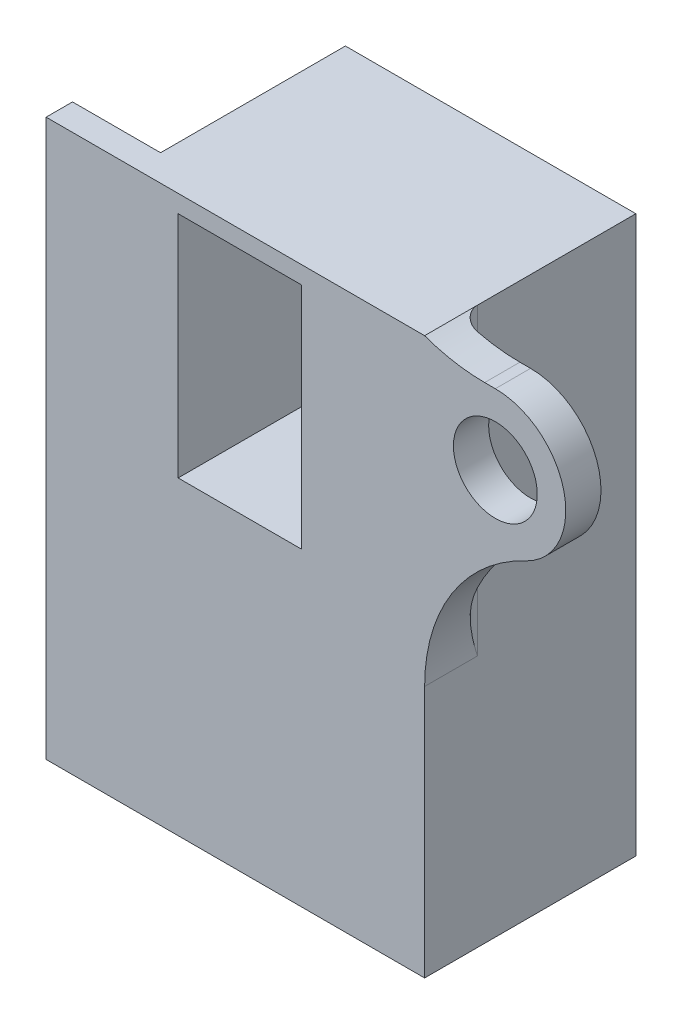
ISO-10303-21;
HEADER;
FILE_DESCRIPTION(('STEP AP214'),'2;1');
FILE_NAME('part.step','',(''),(''),'','','');
FILE_SCHEMA(('AUTOMOTIVE_DESIGN { 1 0 10303 214 1 1 1 1 }'));
ENDSEC;
DATA;
#1=APPLICATION_CONTEXT('core data for automotive mechanical design processes');
#2=APPLICATION_PROTOCOL_DEFINITION('international standard','automotive_design',2000,#1);
#3=PRODUCT_CONTEXT('',#1,'mechanical');
#4=PRODUCT('Part','Part','',(#3));
#5=PRODUCT_RELATED_PRODUCT_CATEGORY('part','',(#4));
#6=PRODUCT_DEFINITION_FORMATION('','',#4);
#7=PRODUCT_DEFINITION_CONTEXT('part definition',#1,'design');
#8=PRODUCT_DEFINITION('design','',#6,#7);
#9=PRODUCT_DEFINITION_SHAPE('','',#8);
#10=(LENGTH_UNIT() NAMED_UNIT(*) SI_UNIT(.MILLI.,.METRE.));
#11=(NAMED_UNIT(*) PLANE_ANGLE_UNIT() SI_UNIT($,.RADIAN.));
#12=(NAMED_UNIT(*) SI_UNIT($,.STERADIAN.) SOLID_ANGLE_UNIT());
#13=UNCERTAINTY_MEASURE_WITH_UNIT(LENGTH_MEASURE(1.E-05),#10,'distance_accuracy_value','');
#14=(GEOMETRIC_REPRESENTATION_CONTEXT(3) GLOBAL_UNCERTAINTY_ASSIGNED_CONTEXT((#13)) GLOBAL_UNIT_ASSIGNED_CONTEXT((#10,
#11,#12)) REPRESENTATION_CONTEXT('',''));
#15=CARTESIAN_POINT('',(0.,0.,0.));
#16=DIRECTION('',(0.,0.,1.));
#17=DIRECTION('',(1.,0.,0.));
#18=AXIS2_PLACEMENT_3D('',#15,#16,#17);
#19=CARTESIAN_POINT('',(0.,0.,0.));
#20=DIRECTION('',(1.,0.,0.));
#21=DIRECTION('',(0.,0.,-1.));
#22=AXIS2_PLACEMENT_3D('',#19,#20,#21);
#23=PLANE('',#22);
#24=DIRECTION('',(0.,0.,1.));
#25=VECTOR('',#24,1.);
#26=CARTESIAN_POINT('',(0.,33.6,-12.));
#27=LINE('',#26,#25);
#28=CARTESIAN_POINT('',(0.,33.6,-12.));
#29=VERTEX_POINT('',#28);
#30=CARTESIAN_POINT('',(0.,33.6,-1.5));
#31=VERTEX_POINT('',#30);
#32=EDGE_CURVE('E159',#29,#31,#27,.T.);
#33=ORIENTED_EDGE('',*,*,#32,.F.);
#34=DIRECTION('',(0.,1.,0.));
#35=VECTOR('',#34,1.);
#36=CARTESIAN_POINT('',(0.,2.,-12.));
#37=LINE('',#36,#35);
#38=CARTESIAN_POINT('',(0.,2.,-12.));
#39=VERTEX_POINT('',#38);
#40=EDGE_CURVE('E162',#39,#29,#37,.T.);
#41=ORIENTED_EDGE('',*,*,#40,.F.);
#42=DIRECTION('',(0.,0.,1.));
#43=VECTOR('',#42,1.);
#44=CARTESIAN_POINT('',(0.,2.,-12.));
#45=LINE('',#44,#43);
#46=CARTESIAN_POINT('',(0.,2.,-1.5));
#47=VERTEX_POINT('',#46);
#48=EDGE_CURVE('E297',#39,#47,#45,.T.);
#49=ORIENTED_EDGE('',*,*,#48,.T.);
#50=DIRECTION('',(0.,-1.,0.));
#51=VECTOR('',#50,1.);
#52=CARTESIAN_POINT('',(0.,37.1,-1.5));
#53=LINE('',#52,#51);
#54=EDGE_CURVE('E164',#31,#47,#53,.T.);
#55=ORIENTED_EDGE('',*,*,#54,.F.);
#56=EDGE_LOOP('',(#33,#41,#49,#55));
#57=FACE_BOUND('',#56,.T.);
#58=ADVANCED_FACE('F43',(#57),#23,.F.);
#59=CARTESIAN_POINT('',(16.5,0.,0.));
#60=DIRECTION('',(0.,0.,-1.));
#61=DIRECTION('',(-1.,0.,0.));
#62=AXIS2_PLACEMENT_3D('',#59,#60,#61);
#63=PLANE('',#62);
#64=DIRECTION('',(-1.,0.,0.));
#65=VECTOR('',#64,1.);
#66=CARTESIAN_POINT('',(0.,32.6,0.));
#67=LINE('',#66,#65);
#68=CARTESIAN_POINT('',(9.5,32.6,0.));
#69=VERTEX_POINT('',#68);
#70=CARTESIAN_POINT('',(2.5,32.6,0.));
#71=VERTEX_POINT('',#70);
#72=EDGE_CURVE('E238',#69,#71,#67,.T.);
#73=ORIENTED_EDGE('',*,*,#72,.F.);
#74=DIRECTION('',(0.,1.,0.));
#75=VECTOR('',#74,1.);
#76=CARTESIAN_POINT('',(9.5,0.,0.));
#77=LINE('',#76,#75);
#78=CARTESIAN_POINT('',(9.5,19.6,0.));
#79=VERTEX_POINT('',#78);
#80=EDGE_CURVE('E217',#79,#69,#77,.T.);
#81=ORIENTED_EDGE('',*,*,#80,.F.);
#82=DIRECTION('',(1.,0.,0.));
#83=VECTOR('',#82,1.);
#84=CARTESIAN_POINT('',(0.,19.6,0.));
#85=LINE('',#84,#83);
#86=CARTESIAN_POINT('',(2.5,19.6,0.));
#87=VERTEX_POINT('',#86);
#88=EDGE_CURVE('E223',#87,#79,#85,.T.);
#89=ORIENTED_EDGE('',*,*,#88,.F.);
#90=DIRECTION('',(0.,-1.,0.));
#91=VECTOR('',#90,1.);
#92=CARTESIAN_POINT('',(2.50000000000001,0.,0.));
#93=LINE('',#92,#91);
#94=EDGE_CURVE('E242',#71,#87,#93,.T.);
#95=ORIENTED_EDGE('',*,*,#94,.F.);
#96=EDGE_LOOP('',(#73,#81,#89,#95));
#97=FACE_BOUND('',#96,.T.);
#98=CARTESIAN_POINT('',(20.5182193377738,29.,0.));
#99=DIRECTION('',(0.,0.,-1.));
#100=DIRECTION('',(-1.,0.,0.));
#101=AXIS2_PLACEMENT_3D('',#98,#99,#100);
#102=CIRCLE('',#101,2.38125);
#103=CARTESIAN_POINT('',(18.1369693377738,29.,0.));
#104=VERTEX_POINT('',#103);
#105=EDGE_CURVE('E273',#104,#104,#102,.T.);
#106=ORIENTED_EDGE('',*,*,#105,.T.);
#107=EDGE_LOOP('',(#106));
#108=FACE_BOUND('',#107,.T.);
#109=DIRECTION('',(-1.,0.,0.));
#110=VECTOR('',#109,1.);
#111=CARTESIAN_POINT('',(0.,33.,0.));
#112=LINE('',#111,#110);
#113=CARTESIAN_POINT('',(20.5182193377738,33.,0.));
#114=VERTEX_POINT('',#113);
#115=CARTESIAN_POINT('',(19.9117444218464,33.,0.));
#116=VERTEX_POINT('',#115);
#117=EDGE_CURVE('E283',#114,#116,#112,.T.);
#118=ORIENTED_EDGE('',*,*,#117,.T.);
#119=CARTESIAN_POINT('',(19.9117444218464,43.,0.));
#120=DIRECTION('',(0.,0.,-1.));
#121=DIRECTION('',(-1.,0.,0.));
#122=AXIS2_PLACEMENT_3D('',#119,#120,#121);
#123=CIRCLE('',#122,10.);
#124=CARTESIAN_POINT('',(16.5,33.6,0.));
#125=VERTEX_POINT('',#124);
#126=EDGE_CURVE('E314',#116,#125,#123,.T.);
#127=ORIENTED_EDGE('',*,*,#126,.T.);
#128=DIRECTION('',(1.,0.,0.));
#129=VECTOR('',#128,1.);
#130=CARTESIAN_POINT('',(-5.,33.6,0.));
#131=LINE('',#130,#129);
#132=CARTESIAN_POINT('',(-5.,33.6,0.));
#133=VERTEX_POINT('',#132);
#134=EDGE_CURVE('E195',#133,#125,#131,.T.);
#135=ORIENTED_EDGE('',*,*,#134,.F.);
#136=DIRECTION('',(0.,1.,0.));
#137=VECTOR('',#136,1.);
#138=CARTESIAN_POINT('',(-5.,2.,0.));
#139=LINE('',#138,#137);
#140=CARTESIAN_POINT('',(-5.,2.,0.));
#141=VERTEX_POINT('',#140);
#142=EDGE_CURVE('E200',#141,#133,#139,.T.);
#143=ORIENTED_EDGE('',*,*,#142,.F.);
#144=DIRECTION('',(1.,0.,0.));
#145=VECTOR('',#144,1.);
#146=CARTESIAN_POINT('',(0.,2.,0.));
#147=LINE('',#146,#145);
#148=CARTESIAN_POINT('',(16.5,2.,0.));
#149=VERTEX_POINT('',#148);
#150=EDGE_CURVE('E300',#141,#149,#147,.T.);
#151=ORIENTED_EDGE('',*,*,#150,.T.);
#152=DIRECTION('',(0.,-1.,0.));
#153=VECTOR('',#152,1.);
#154=CARTESIAN_POINT('',(16.5,0.,0.));
#155=LINE('',#154,#153);
#156=CARTESIAN_POINT('',(16.5,16.342263231169,0.));
#157=VERTEX_POINT('',#156);
#158=EDGE_CURVE('E306',#157,#149,#155,.T.);
#159=ORIENTED_EDGE('',*,*,#158,.F.);
#160=CARTESIAN_POINT('',(26.5,16.342263231169,0.));
#161=DIRECTION('',(0.,0.,-1.));
#162=DIRECTION('',(-1.,0.,0.));
#163=AXIS2_PLACEMENT_3D('',#160,#161,#162);
#164=CIRCLE('',#163,10.);
#165=CARTESIAN_POINT('',(22.2272995269813,25.383503780334,0.));
#166=VERTEX_POINT('',#165);
#167=EDGE_CURVE('E325',#157,#166,#164,.T.);
#168=ORIENTED_EDGE('',*,*,#167,.T.);
#169=CARTESIAN_POINT('',(20.5182193377738,29.,0.));
#170=DIRECTION('',(0.,0.,1.));
#171=DIRECTION('',(1.,0.,0.));
#172=AXIS2_PLACEMENT_3D('',#169,#170,#171);
#173=CIRCLE('',#172,4.);
#174=EDGE_CURVE('E277',#114,#166,#173,.F.);
#175=ORIENTED_EDGE('',*,*,#174,.F.);
#176=EDGE_LOOP('',(#118,#127,#135,#143,#151,#159,#168,#175));
#177=FACE_BOUND('',#176,.T.);
#178=ADVANCED_FACE('F351',(#97,#108,#177),#63,.F.);
#179=CARTESIAN_POINT('',(16.5,0.,0.));
#180=DIRECTION('',(1.,0.,0.));
#181=DIRECTION('',(0.,0.,-1.));
#182=AXIS2_PLACEMENT_3D('',#179,#180,#181);
#183=PLANE('',#182);
#184=DIRECTION('',(0.,0.,1.));
#185=VECTOR('',#184,1.);
#186=CARTESIAN_POINT('',(16.5,2.,-12.));
#187=LINE('',#186,#185);
#188=CARTESIAN_POINT('',(16.5,2.,-12.));
#189=VERTEX_POINT('',#188);
#190=EDGE_CURVE('E296',#189,#149,#187,.T.);
#191=ORIENTED_EDGE('',*,*,#190,.F.);
#192=DIRECTION('',(0.,-1.,0.));
#193=VECTOR('',#192,1.);
#194=CARTESIAN_POINT('',(16.5,2.,-12.));
#195=LINE('',#194,#193);
#196=CARTESIAN_POINT('',(16.5,33.6,-12.));
#197=VERTEX_POINT('',#196);
#198=EDGE_CURVE('E178',#197,#189,#195,.T.);
#199=ORIENTED_EDGE('',*,*,#198,.F.);
#200=DIRECTION('',(0.,0.,-1.));
#201=VECTOR('',#200,1.);
#202=CARTESIAN_POINT('',(16.5,33.6,0.));
#203=LINE('',#202,#201);
#204=CARTESIAN_POINT('',(16.5,33.6,-3.));
#205=VERTEX_POINT('',#204);
#206=EDGE_CURVE('E173',#205,#197,#203,.T.);
#207=ORIENTED_EDGE('',*,*,#206,.F.);
#208=DIRECTION('',(0.,1.,0.));
#209=VECTOR('',#208,1.);
#210=CARTESIAN_POINT('',(16.5,0.,-3.));
#211=LINE('',#210,#209);
#212=CARTESIAN_POINT('',(16.5,16.342263231169,-3.));
#213=VERTEX_POINT('',#212);
#214=EDGE_CURVE('E336',#205,#213,#211,.F.);
#215=ORIENTED_EDGE('',*,*,#214,.T.);
#216=DIRECTION('',(0.,0.,1.));
#217=VECTOR('',#216,1.);
#218=CARTESIAN_POINT('',(16.5,16.342263231169,0.));
#219=LINE('',#218,#217);
#220=EDGE_CURVE('E71',#213,#157,#219,.T.);
#221=ORIENTED_EDGE('',*,*,#220,.T.);
#222=ORIENTED_EDGE('',*,*,#158,.T.);
#223=EDGE_LOOP('',(#191,#199,#207,#215,#221,#222));
#224=FACE_BOUND('',#223,.T.);
#225=ADVANCED_FACE('F365',(#224),#183,.T.);
#226=CARTESIAN_POINT('',(0.,2.,-12.));
#227=DIRECTION('',(0.,1.,0.));
#228=DIRECTION('',(0.,0.,1.));
#229=AXIS2_PLACEMENT_3D('',#226,#227,#228);
#230=PLANE('',#229);
#231=CARTESIAN_POINT('',(8.25,2.,-6.));
#232=DIRECTION('',(0.,-1.,0.));
#233=DIRECTION('',(0.,0.,-1.));
#234=AXIS2_PLACEMENT_3D('',#231,#232,#233);
#235=CIRCLE('',#234,2.38125);
#236=CARTESIAN_POINT('',(8.25,2.,-8.38125));
#237=VERTEX_POINT('',#236);
#238=EDGE_CURVE('E252',#237,#237,#235,.T.);
#239=ORIENTED_EDGE('',*,*,#238,.F.);
#240=EDGE_LOOP('',(#239));
#241=FACE_BOUND('',#240,.T.);
#242=ORIENTED_EDGE('',*,*,#48,.F.);
#243=DIRECTION('',(-1.,0.,0.));
#244=VECTOR('',#243,1.);
#245=CARTESIAN_POINT('',(0.,2.,-12.));
#246=LINE('',#245,#244);
#247=EDGE_CURVE('E168',#189,#39,#246,.T.);
#248=ORIENTED_EDGE('',*,*,#247,.F.);
#249=ORIENTED_EDGE('',*,*,#190,.T.);
#250=ORIENTED_EDGE('',*,*,#150,.F.);
#251=DIRECTION('',(0.,0.,1.));
#252=VECTOR('',#251,1.);
#253=CARTESIAN_POINT('',(-5.,2.,-1.5));
#254=LINE('',#253,#252);
#255=CARTESIAN_POINT('',(-5.,2.,-1.5));
#256=VERTEX_POINT('',#255);
#257=EDGE_CURVE('E207',#256,#141,#254,.T.);
#258=ORIENTED_EDGE('',*,*,#257,.F.);
#259=DIRECTION('',(1.,0.,0.));
#260=VECTOR('',#259,1.);
#261=CARTESIAN_POINT('',(-5.,2.,-1.5));
#262=LINE('',#261,#260);
#263=EDGE_CURVE('E211',#256,#47,#262,.T.);
#264=ORIENTED_EDGE('',*,*,#263,.T.);
#265=EDGE_LOOP('',(#242,#248,#249,#250,#258,#264));
#266=FACE_BOUND('',#265,.T.);
#267=ADVANCED_FACE('F369',(#241,#266),#230,.F.);
#268=CARTESIAN_POINT('',(20.5182193377738,29.,-2.));
#269=DIRECTION('',(0.,0.,1.));
#270=DIRECTION('',(1.,0.,0.));
#271=AXIS2_PLACEMENT_3D('',#268,#269,#270);
#272=CYLINDRICAL_SURFACE('',#271,4.);
#273=ORIENTED_EDGE('',*,*,#174,.T.);
#274=DIRECTION('',(0.,0.,1.));
#275=VECTOR('',#274,1.);
#276=CARTESIAN_POINT('',(22.2272995269813,25.383503780334,-2.));
#277=LINE('',#276,#275);
#278=CARTESIAN_POINT('',(22.2272995269813,25.383503780334,-2.));
#279=VERTEX_POINT('',#278);
#280=EDGE_CURVE('E322',#166,#279,#277,.F.);
#281=ORIENTED_EDGE('',*,*,#280,.T.);
#282=CARTESIAN_POINT('',(20.5182193377738,29.,-2.));
#283=DIRECTION('',(0.,0.,1.));
#284=DIRECTION('',(1.,0.,0.));
#285=AXIS2_PLACEMENT_3D('',#282,#283,#284);
#286=CIRCLE('',#285,4.);
#287=CARTESIAN_POINT('',(20.5182193377738,33.,-2.));
#288=VERTEX_POINT('',#287);
#289=EDGE_CURVE('E278',#288,#279,#286,.F.);
#290=ORIENTED_EDGE('',*,*,#289,.F.);
#291=DIRECTION('',(0.,0.,1.));
#292=VECTOR('',#291,1.);
#293=CARTESIAN_POINT('',(20.5182193377738,33.,-2.));
#294=LINE('',#293,#292);
#295=EDGE_CURVE('E287',#288,#114,#294,.T.);
#296=ORIENTED_EDGE('',*,*,#295,.T.);
#297=EDGE_LOOP('',(#273,#281,#290,#296));
#298=FACE_BOUND('',#297,.T.);
#299=ADVANCED_FACE('F373',(#298),#272,.T.);
#300=CARTESIAN_POINT('',(0.,33.,-2.));
#301=DIRECTION('',(0.,1.,0.));
#302=DIRECTION('',(0.,0.,1.));
#303=AXIS2_PLACEMENT_3D('',#300,#301,#302);
#304=PLANE('',#303);
#305=DIRECTION('',(-1.,0.,0.));
#306=VECTOR('',#305,1.);
#307=CARTESIAN_POINT('',(0.,33.,-2.));
#308=LINE('',#307,#306);
#309=CARTESIAN_POINT('',(19.9117444218464,33.,-2.));
#310=VERTEX_POINT('',#309);
#311=EDGE_CURVE('E282',#288,#310,#308,.T.);
#312=ORIENTED_EDGE('',*,*,#311,.T.);
#313=DIRECTION('',(0.,0.,1.));
#314=VECTOR('',#313,1.);
#315=CARTESIAN_POINT('',(19.9117444218464,33.,0.));
#316=LINE('',#315,#314);
#317=EDGE_CURVE('E310',#310,#116,#316,.T.);
#318=ORIENTED_EDGE('',*,*,#317,.T.);
#319=ORIENTED_EDGE('',*,*,#117,.F.);
#320=ORIENTED_EDGE('',*,*,#295,.F.);
#321=EDGE_LOOP('',(#312,#318,#319,#320));
#322=FACE_BOUND('',#321,.T.);
#323=ADVANCED_FACE('F377',(#322),#304,.T.);
#324=CARTESIAN_POINT('',(0.,0.,-2.));
#325=DIRECTION('',(0.,0.,1.));
#326=DIRECTION('',(1.,0.,0.));
#327=AXIS2_PLACEMENT_3D('',#324,#325,#326);
#328=PLANE('',#327);
#329=CARTESIAN_POINT('',(20.5182193377738,29.,-2.));
#330=DIRECTION('',(0.,0.,-1.));
#331=DIRECTION('',(-1.,0.,0.));
#332=AXIS2_PLACEMENT_3D('',#329,#330,#331);
#333=CIRCLE('',#332,2.38125);
#334=CARTESIAN_POINT('',(18.1369693377738,29.,-2.));
#335=VERTEX_POINT('',#334);
#336=EDGE_CURVE('E266',#335,#335,#333,.T.);
#337=ORIENTED_EDGE('',*,*,#336,.F.);
#338=EDGE_LOOP('',(#337));
#339=FACE_BOUND('',#338,.T.);
#340=CARTESIAN_POINT('',(26.5,16.342263231169,-2.));
#341=DIRECTION('',(0.,0.,1.));
#342=DIRECTION('',(1.,0.,0.));
#343=AXIS2_PLACEMENT_3D('',#340,#341,#342);
#344=CIRCLE('',#343,10.);
#345=CARTESIAN_POINT('',(17.5,20.7011621747097,-2.));
#346=VERTEX_POINT('',#345);
#347=EDGE_CURVE('E328',#279,#346,#344,.T.);
#348=ORIENTED_EDGE('',*,*,#347,.T.);
#349=DIRECTION('',(0.,1.,0.));
#350=VECTOR('',#349,1.);
#351=CARTESIAN_POINT('',(17.5,0.,-2.));
#352=LINE('',#351,#350);
#353=CARTESIAN_POINT('',(17.5,33.2951821839,-2.));
#354=VERTEX_POINT('',#353);
#355=EDGE_CURVE('E332',#346,#354,#352,.T.);
#356=ORIENTED_EDGE('',*,*,#355,.T.);
#357=CARTESIAN_POINT('',(19.9117444218464,43.,-2.));
#358=DIRECTION('',(0.,0.,1.));
#359=DIRECTION('',(1.,0.,0.));
#360=AXIS2_PLACEMENT_3D('',#357,#358,#359);
#361=CIRCLE('',#360,10.);
#362=EDGE_CURVE('E317',#354,#310,#361,.T.);
#363=ORIENTED_EDGE('',*,*,#362,.T.);
#364=ORIENTED_EDGE('',*,*,#311,.F.);
#365=ORIENTED_EDGE('',*,*,#289,.T.);
#366=EDGE_LOOP('',(#348,#356,#363,#364,#365));
#367=FACE_BOUND('',#366,.T.);
#368=ADVANCED_FACE('F381',(#339,#367),#328,.F.);
#369=CARTESIAN_POINT('',(20.5182193377738,29.,10.6066017177982));
#370=DIRECTION('',(0.,0.,-1.));
#371=DIRECTION('',(-1.,0.,0.));
#372=AXIS2_PLACEMENT_3D('',#369,#370,#371);
#373=CYLINDRICAL_SURFACE('',#372,2.38125);
#374=ORIENTED_EDGE('',*,*,#336,.T.);
#375=EDGE_LOOP('',(#374));
#376=FACE_BOUND('',#375,.T.);
#377=ORIENTED_EDGE('',*,*,#105,.F.);
#378=EDGE_LOOP('',(#377));
#379=FACE_BOUND('',#378,.T.);
#380=ADVANCED_FACE('F385',(#376,#379),#373,.F.);
#381=CARTESIAN_POINT('',(8.25,8.35,-6.));
#382=DIRECTION('',(0.,-1.,0.));
#383=DIRECTION('',(0.,0.,-1.));
#384=AXIS2_PLACEMENT_3D('',#381,#382,#383);
#385=CYLINDRICAL_SURFACE('',#384,2.38125);
#386=CARTESIAN_POINT('',(8.25,8.35,-6.));
#387=DIRECTION('',(0.,-1.,0.));
#388=DIRECTION('',(0.,0.,-1.));
#389=AXIS2_PLACEMENT_3D('',#386,#387,#388);
#390=CIRCLE('',#389,2.38125);
#391=CARTESIAN_POINT('',(8.25,8.35,-8.38125));
#392=VERTEX_POINT('',#391);
#393=EDGE_CURVE('E262',#392,#392,#390,.T.);
#394=ORIENTED_EDGE('',*,*,#393,.F.);
#395=EDGE_LOOP('',(#394));
#396=FACE_BOUND('',#395,.T.);
#397=ORIENTED_EDGE('',*,*,#238,.T.);
#398=EDGE_LOOP('',(#397));
#399=FACE_BOUND('',#398,.T.);
#400=ADVANCED_FACE('F389',(#396,#399),#385,.F.);
#401=CARTESIAN_POINT('',(0.,8.35,0.));
#402=DIRECTION('',(0.,-1.,0.));
#403=DIRECTION('',(0.,0.,-1.));
#404=AXIS2_PLACEMENT_3D('',#401,#402,#403);
#405=PLANE('',#404);
#406=ORIENTED_EDGE('',*,*,#393,.T.);
#407=EDGE_LOOP('',(#406));
#408=FACE_BOUND('',#407,.T.);
#409=ADVANCED_FACE('F393',(#408),#405,.T.);
#410=CARTESIAN_POINT('',(9.5,0.,-7.));
#411=DIRECTION('',(1.,0.,0.));
#412=DIRECTION('',(0.,0.,-1.));
#413=AXIS2_PLACEMENT_3D('',#410,#411,#412);
#414=PLANE('',#413);
#415=ORIENTED_EDGE('',*,*,#80,.T.);
#416=DIRECTION('',(0.,0.,1.));
#417=VECTOR('',#416,1.);
#418=CARTESIAN_POINT('',(9.5,32.6,-7.));
#419=LINE('',#418,#417);
#420=CARTESIAN_POINT('',(9.5,32.6,-7.));
#421=VERTEX_POINT('',#420);
#422=EDGE_CURVE('E235',#421,#69,#419,.T.);
#423=ORIENTED_EDGE('',*,*,#422,.F.);
#424=DIRECTION('',(0.,1.,0.));
#425=VECTOR('',#424,1.);
#426=CARTESIAN_POINT('',(9.5,0.,-7.));
#427=LINE('',#426,#425);
#428=CARTESIAN_POINT('',(9.5,19.6,-7.));
#429=VERTEX_POINT('',#428);
#430=EDGE_CURVE('E218',#429,#421,#427,.T.);
#431=ORIENTED_EDGE('',*,*,#430,.F.);
#432=DIRECTION('',(0.,0.,1.));
#433=VECTOR('',#432,1.);
#434=CARTESIAN_POINT('',(9.5,19.6,-7.));
#435=LINE('',#434,#433);
#436=EDGE_CURVE('E249',#429,#79,#435,.T.);
#437=ORIENTED_EDGE('',*,*,#436,.T.);
#438=EDGE_LOOP('',(#415,#423,#431,#437));
#439=FACE_BOUND('',#438,.T.);
#440=ADVANCED_FACE('F397',(#439),#414,.F.);
#441=CARTESIAN_POINT('',(0.,19.6,-7.));
#442=DIRECTION('',(0.,-1.,0.));
#443=DIRECTION('',(0.,0.,-1.));
#444=AXIS2_PLACEMENT_3D('',#441,#442,#443);
#445=PLANE('',#444);
#446=ORIENTED_EDGE('',*,*,#88,.T.);
#447=ORIENTED_EDGE('',*,*,#436,.F.);
#448=DIRECTION('',(1.,0.,0.));
#449=VECTOR('',#448,1.);
#450=CARTESIAN_POINT('',(0.,19.6,-7.));
#451=LINE('',#450,#449);
#452=CARTESIAN_POINT('',(2.5,19.6,-7.));
#453=VERTEX_POINT('',#452);
#454=EDGE_CURVE('E231',#453,#429,#451,.T.);
#455=ORIENTED_EDGE('',*,*,#454,.F.);
#456=DIRECTION('',(0.,0.,1.));
#457=VECTOR('',#456,1.);
#458=CARTESIAN_POINT('',(2.5,19.6,-7.));
#459=LINE('',#458,#457);
#460=EDGE_CURVE('E253',#453,#87,#459,.T.);
#461=ORIENTED_EDGE('',*,*,#460,.T.);
#462=EDGE_LOOP('',(#446,#447,#455,#461));
#463=FACE_BOUND('',#462,.T.);
#464=ADVANCED_FACE('F401',(#463),#445,.F.);
#465=CARTESIAN_POINT('',(2.50000000000001,0.,-7.));
#466=DIRECTION('',(-1.,0.,0.));
#467=DIRECTION('',(0.,-1.,0.));
#468=AXIS2_PLACEMENT_3D('',#465,#466,#467);
#469=PLANE('',#468);
#470=ORIENTED_EDGE('',*,*,#94,.T.);
#471=ORIENTED_EDGE('',*,*,#460,.F.);
#472=DIRECTION('',(0.,-1.,0.));
#473=VECTOR('',#472,1.);
#474=CARTESIAN_POINT('',(2.50000000000001,0.,-7.));
#475=LINE('',#474,#473);
#476=CARTESIAN_POINT('',(2.5,32.6,-7.));
#477=VERTEX_POINT('',#476);
#478=EDGE_CURVE('E227',#477,#453,#475,.T.);
#479=ORIENTED_EDGE('',*,*,#478,.F.);
#480=DIRECTION('',(0.,0.,1.));
#481=VECTOR('',#480,1.);
#482=CARTESIAN_POINT('',(2.5,32.6,-7.));
#483=LINE('',#482,#481);
#484=EDGE_CURVE('E256',#477,#71,#483,.T.);
#485=ORIENTED_EDGE('',*,*,#484,.T.);
#486=EDGE_LOOP('',(#470,#471,#479,#485));
#487=FACE_BOUND('',#486,.T.);
#488=ADVANCED_FACE('F407',(#487),#469,.F.);
#489=CARTESIAN_POINT('',(0.,32.6,-7.));
#490=DIRECTION('',(0.,1.,0.));
#491=DIRECTION('',(0.,0.,1.));
#492=AXIS2_PLACEMENT_3D('',#489,#490,#491);
#493=PLANE('',#492);
#494=ORIENTED_EDGE('',*,*,#72,.T.);
#495=ORIENTED_EDGE('',*,*,#484,.F.);
#496=DIRECTION('',(-1.,0.,0.));
#497=VECTOR('',#496,1.);
#498=CARTESIAN_POINT('',(0.,32.6,-7.));
#499=LINE('',#498,#497);
#500=EDGE_CURVE('E222',#421,#477,#499,.T.);
#501=ORIENTED_EDGE('',*,*,#500,.F.);
#502=ORIENTED_EDGE('',*,*,#422,.T.);
#503=EDGE_LOOP('',(#494,#495,#501,#502));
#504=FACE_BOUND('',#503,.T.);
#505=ADVANCED_FACE('F403',(#504),#493,.F.);
#506=CARTESIAN_POINT('',(0.,0.,-7.));
#507=DIRECTION('',(0.,0.,1.));
#508=DIRECTION('',(1.,0.,0.));
#509=AXIS2_PLACEMENT_3D('',#506,#507,#508);
#510=PLANE('',#509);
#511=ORIENTED_EDGE('',*,*,#430,.T.);
#512=ORIENTED_EDGE('',*,*,#500,.T.);
#513=ORIENTED_EDGE('',*,*,#478,.T.);
#514=ORIENTED_EDGE('',*,*,#454,.T.);
#515=EDGE_LOOP('',(#511,#512,#513,#514));
#516=FACE_BOUND('',#515,.T.);
#517=ADVANCED_FACE('F406',(#516),#510,.T.);
#518=CARTESIAN_POINT('',(-5.,37.1,-1.5));
#519=DIRECTION('',(0.,0.,1.));
#520=DIRECTION('',(0.,-1.,0.));
#521=AXIS2_PLACEMENT_3D('',#518,#519,#520);
#522=PLANE('',#521);
#523=DIRECTION('',(0.,-1.,0.));
#524=VECTOR('',#523,1.);
#525=CARTESIAN_POINT('',(-5.,37.1,-1.5));
#526=LINE('',#525,#524);
#527=CARTESIAN_POINT('',(-5.,33.6,-1.5));
#528=VERTEX_POINT('',#527);
#529=EDGE_CURVE('E204',#528,#256,#526,.T.);
#530=ORIENTED_EDGE('',*,*,#529,.F.);
#531=DIRECTION('',(-1.,0.,0.));
#532=VECTOR('',#531,1.);
#533=CARTESIAN_POINT('',(0.,33.6,-1.5));
#534=LINE('',#533,#532);
#535=EDGE_CURVE('E167',#31,#528,#534,.T.);
#536=ORIENTED_EDGE('',*,*,#535,.F.);
#537=ORIENTED_EDGE('',*,*,#54,.T.);
#538=ORIENTED_EDGE('',*,*,#263,.F.);
#539=EDGE_LOOP('',(#530,#536,#537,#538));
#540=FACE_BOUND('',#539,.T.);
#541=ADVANCED_FACE('F417',(#540),#522,.F.);
#542=CARTESIAN_POINT('',(-5.,0.,0.));
#543=DIRECTION('',(-1.,0.,0.));
#544=DIRECTION('',(0.,0.,1.));
#545=AXIS2_PLACEMENT_3D('',#542,#543,#544);
#546=PLANE('',#545);
#547=DIRECTION('',(0.,0.,1.));
#548=VECTOR('',#547,1.);
#549=CARTESIAN_POINT('',(-5.,33.6,-1.5));
#550=LINE('',#549,#548);
#551=EDGE_CURVE('E192',#528,#133,#550,.T.);
#552=ORIENTED_EDGE('',*,*,#551,.F.);
#553=ORIENTED_EDGE('',*,*,#529,.T.);
#554=ORIENTED_EDGE('',*,*,#257,.T.);
#555=ORIENTED_EDGE('',*,*,#142,.T.);
#556=EDGE_LOOP('',(#552,#553,#554,#555));
#557=FACE_BOUND('',#556,.T.);
#558=ADVANCED_FACE('F421',(#557),#546,.T.);
#559=CARTESIAN_POINT('',(0.,33.6,0.));
#560=DIRECTION('',(0.,-1.,0.));
#561=DIRECTION('',(0.,0.,-1.));
#562=AXIS2_PLACEMENT_3D('',#559,#560,#561);
#563=PLANE('',#562);
#564=ORIENTED_EDGE('',*,*,#206,.T.);
#565=DIRECTION('',(1.,0.,0.));
#566=VECTOR('',#565,1.);
#567=CARTESIAN_POINT('',(0.,33.6,-12.));
#568=LINE('',#567,#566);
#569=EDGE_CURVE('E171',#29,#197,#568,.T.);
#570=ORIENTED_EDGE('',*,*,#569,.F.);
#571=ORIENTED_EDGE('',*,*,#32,.T.);
#572=ORIENTED_EDGE('',*,*,#535,.T.);
#573=ORIENTED_EDGE('',*,*,#551,.T.);
#574=ORIENTED_EDGE('',*,*,#134,.T.);
#575=EDGE_CURVE('E64',#125,#205,#203,.T.);
#576=ORIENTED_EDGE('',*,*,#575,.T.);
#577=EDGE_LOOP('',(#564,#570,#571,#572,#573,#574,#576));
#578=FACE_BOUND('',#577,.T.);
#579=ADVANCED_FACE('F172',(#578),#563,.F.);
#580=CARTESIAN_POINT('',(19.9117444218464,43.,0.));
#581=DIRECTION('',(0.,0.,-1.));
#582=DIRECTION('',(-1.,0.,0.));
#583=AXIS2_PLACEMENT_3D('',#580,#581,#582);
#584=CYLINDRICAL_SURFACE('',#583,10.);
#585=ORIENTED_EDGE('',*,*,#362,.F.);
#586=CARTESIAN_POINT('',(17.5,33.2951821839,-2.));
#587=CARTESIAN_POINT('',(17.4416882046076,33.3096521513916,-1.99996377159555));
#588=CARTESIAN_POINT('',(17.3835448570359,33.3246797672575,-2.00509729641203));
#589=CARTESIAN_POINT('',(17.2691894306341,33.3552970068834,-2.02528178802682));
#590=CARTESIAN_POINT('',(17.2129763122904,33.370886318572,-2.04032732575709));
#591=CARTESIAN_POINT('',(17.1039998442129,33.4020931624776,-2.07991778830303));
#592=CARTESIAN_POINT('',(17.0512370422384,33.417710698773,-2.10446421718611));
#593=CARTESIAN_POINT('',(16.9506212007074,33.4483242872222,-2.16241344629458));
#594=CARTESIAN_POINT('',(16.9027678199665,33.4633203825204,-2.19581563050275));
#595=CARTESIAN_POINT('',(16.8133948734528,33.4919804261872,-2.27063887890849));
#596=CARTESIAN_POINT('',(16.7718704395181,33.5056453954947,-2.31205372362896));
#597=CARTESIAN_POINT('',(16.6964431848553,33.5309227438538,-2.40189151600445));
#598=CARTESIAN_POINT('',(16.6625404522537,33.5425350991717,-2.45031454468144));
#599=CARTESIAN_POINT('',(16.6046947097274,33.5626100803941,-2.55092090933748));
#600=CARTESIAN_POINT('',(16.5804299370159,33.5711732462641,-2.60289915195508));
#601=CARTESIAN_POINT('',(16.5410873005675,33.5851653108669,-2.71058607085887));
#602=CARTESIAN_POINT('',(16.5259962909772,33.590598693939,-2.76628928157378));
#603=CARTESIAN_POINT('',(16.5105487685177,33.5961765065227,-2.85211540040821));
#604=CARTESIAN_POINT('',(16.5065958447039,33.5976080034534,-2.88155237267648));
#605=CARTESIAN_POINT('',(16.5013224671775,33.5995199180946,-2.94065406686891));
#606=CARTESIAN_POINT('',(16.4999986917682,33.600001535888,-2.97031845382046));
#607=CARTESIAN_POINT('',(16.5,33.6,-3.));
#608=B_SPLINE_CURVE_WITH_KNOTS('',3,(#586,#587,#588,#589,#590,#591,#592,#593,#594,#595,#596,
#597,#598,#599,#600,#601,#602,#603,#604,#605,#606,#607),.UNSPECIFIED.,.F.,.F.,(4,2,2,2,2,2,2,2,
2,2,4),(0.,0.179979391065258,0.359860284590325,0.539769666360691,0.719666536695732,
0.899424326151548,1.07918419396243,1.25230100574518,1.42516915555092,1.51425951775296,
1.60323725036706),.UNSPECIFIED.);
#609=EDGE_CURVE('E57',#354,#205,#608,.T.);
#610=ORIENTED_EDGE('',*,*,#609,.T.);
#611=ORIENTED_EDGE('',*,*,#575,.F.);
#612=ORIENTED_EDGE('',*,*,#126,.F.);
#613=ORIENTED_EDGE('',*,*,#317,.F.);
#614=EDGE_LOOP('',(#585,#610,#611,#612,#613));
#615=FACE_BOUND('',#614,.T.);
#616=ADVANCED_FACE('F345',(#615),#584,.F.);
#617=CARTESIAN_POINT('',(26.5,16.342263231169,-2.));
#618=DIRECTION('',(0.,0.,1.));
#619=DIRECTION('',(1.,0.,0.));
#620=AXIS2_PLACEMENT_3D('',#617,#618,#619);
#621=CYLINDRICAL_SURFACE('',#620,10.);
#622=ORIENTED_EDGE('',*,*,#347,.F.);
#623=ORIENTED_EDGE('',*,*,#280,.F.);
#624=ORIENTED_EDGE('',*,*,#167,.F.);
#625=ORIENTED_EDGE('',*,*,#220,.F.);
#626=CARTESIAN_POINT('',(17.5,20.7011621747097,-2.));
#627=CARTESIAN_POINT('',(17.4649705918882,20.6288396959497,-2.00001517907888));
#628=CARTESIAN_POINT('',(17.4308249738421,20.556111587016,-2.00183974990828));
#629=CARTESIAN_POINT('',(17.3643618176126,20.4100074789031,-2.00867500405915));
#630=CARTESIAN_POINT('',(17.3320435036572,20.336631770189,-2.01368432408378));
#631=CARTESIAN_POINT('',(17.2693266347427,20.1894773913306,-2.02644469931918));
#632=CARTESIAN_POINT('',(17.2389244580283,20.1156997864008,-2.03419038738089));
#633=CARTESIAN_POINT('',(17.1799867691033,19.9676874000717,-2.05208658188006));
#634=CARTESIAN_POINT('',(17.1514514850332,19.8934525640055,-2.06223738153228));
#635=CARTESIAN_POINT('',(17.0688926274996,19.6708057930277,-2.09574919733705));
#636=CARTESIAN_POINT('',(17.017647311377,19.5218199539269,-2.12222969644671));
#637=CARTESIAN_POINT('',(16.9225479634451,19.2227266295524,-2.18165298985507));
#638=CARTESIAN_POINT('',(16.8786986935253,19.0726184861419,-2.21459991820859));
#639=CARTESIAN_POINT('',(16.7820109335453,18.7105191846494,-2.29987772594522));
#640=CARTESIAN_POINT('',(16.732746945945,18.4981381547551,-2.35464870463528));
#641=CARTESIAN_POINT('',(16.6484261900647,18.0724702024824,-2.47087286474006));
#642=CARTESIAN_POINT('',(16.6133715529952,17.8591831490567,-2.53232704679311));
#643=CARTESIAN_POINT('',(16.5291314236184,17.2182827355187,-2.72300296786534));
#644=CARTESIAN_POINT('',(16.5008343674646,16.7894961375238,-2.85857288785149));
#645=CARTESIAN_POINT('',(16.5000060646769,16.3549759307317,-2.99597991124583));
#646=CARTESIAN_POINT('',(16.5000000044712,16.3486195087201,-2.99798998882368));
#647=CARTESIAN_POINT('',(16.5,16.342263231169,-3.));
#648=B_SPLINE_CURVE_WITH_KNOTS('',3,(#626,#627,#628,#629,#630,#631,#632,#633,#634,#635,#636,
#637,#638,#639,#640,#641,#642,#643,#644,#645,#646,#647),.UNSPECIFIED.,.F.,.F.,(4,2,2,2,2,2,2,2,
2,2,4),(0.,0.241022397911186,0.481941690674264,0.722391040963445,0.962869720289598,
1.44176483881817,1.92096712310371,2.59465687968437,3.26844764326604,4.61560355969885,
4.63560356796335),.UNSPECIFIED.);
#649=EDGE_CURVE('E11',#213,#346,#648,.F.);
#650=ORIENTED_EDGE('',*,*,#649,.T.);
#651=EDGE_LOOP('',(#622,#623,#624,#625,#650));
#652=FACE_BOUND('',#651,.T.);
#653=ADVANCED_FACE('F349',(#652),#621,.F.);
#654=CARTESIAN_POINT('',(17.5,0.,-3.));
#655=DIRECTION('',(0.,1.,0.));
#656=DIRECTION('',(0.,0.,1.));
#657=AXIS2_PLACEMENT_3D('',#654,#655,#656);
#658=CYLINDRICAL_SURFACE('',#657,1.);
#659=ORIENTED_EDGE('',*,*,#649,.F.);
#660=ORIENTED_EDGE('',*,*,#214,.F.);
#661=ORIENTED_EDGE('',*,*,#609,.F.);
#662=ORIENTED_EDGE('',*,*,#355,.F.);
#663=EDGE_LOOP('',(#659,#660,#661,#662));
#664=FACE_BOUND('',#663,.T.);
#665=ADVANCED_FACE('F45',(#664),#658,.F.);
#666=CARTESIAN_POINT('',(0.,0.,-12.));
#667=DIRECTION('',(0.,0.,-1.));
#668=DIRECTION('',(-1.,0.,0.));
#669=AXIS2_PLACEMENT_3D('',#666,#667,#668);
#670=PLANE('',#669);
#671=ORIENTED_EDGE('',*,*,#40,.T.);
#672=ORIENTED_EDGE('',*,*,#569,.T.);
#673=ORIENTED_EDGE('',*,*,#198,.T.);
#674=ORIENTED_EDGE('',*,*,#247,.T.);
#675=EDGE_LOOP('',(#671,#672,#673,#674));
#676=FACE_BOUND('',#675,.T.);
#677=ADVANCED_FACE('F181',(#676),#670,.T.);
#678=CLOSED_SHELL('',(#58,#178,#225,#267,#299,#323,#368,#380,#400,#409,#440,#464,#488,#505,#517,
#541,#558,#579,#616,#653,#665,#677));
#679=MANIFOLD_SOLID_BREP('B2',#678);
#680=ADVANCED_BREP_SHAPE_REPRESENTATION('',(#18,#679),#14);
#681=SHAPE_DEFINITION_REPRESENTATION(#9,#680);
ENDSEC;
END-ISO-10303-21;
